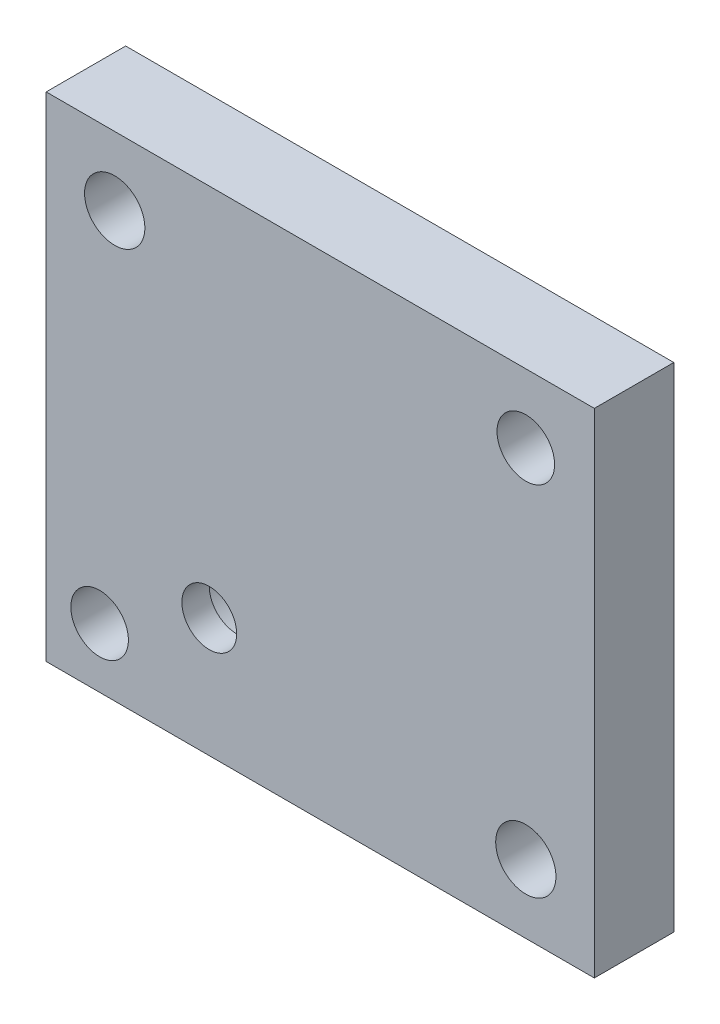
ISO-10303-21;
HEADER;
FILE_DESCRIPTION(('STEP AP214'),'2;1');
FILE_NAME('part.step','',(''),(''),'','','');
FILE_SCHEMA(('AUTOMOTIVE_DESIGN { 1 0 10303 214 1 1 1 1 }'));
ENDSEC;
DATA;
#1=APPLICATION_CONTEXT('core data for automotive mechanical design processes');
#2=APPLICATION_PROTOCOL_DEFINITION('international standard','automotive_design',2000,#1);
#3=PRODUCT_CONTEXT('',#1,'mechanical');
#4=PRODUCT('Part','Part','',(#3));
#5=PRODUCT_RELATED_PRODUCT_CATEGORY('part','',(#4));
#6=PRODUCT_DEFINITION_FORMATION('','',#4);
#7=PRODUCT_DEFINITION_CONTEXT('part definition',#1,'design');
#8=PRODUCT_DEFINITION('design','',#6,#7);
#9=PRODUCT_DEFINITION_SHAPE('','',#8);
#10=(LENGTH_UNIT() NAMED_UNIT(*) SI_UNIT(.MILLI.,.METRE.));
#11=(NAMED_UNIT(*) PLANE_ANGLE_UNIT() SI_UNIT($,.RADIAN.));
#12=(NAMED_UNIT(*) SI_UNIT($,.STERADIAN.) SOLID_ANGLE_UNIT());
#13=UNCERTAINTY_MEASURE_WITH_UNIT(LENGTH_MEASURE(1.E-05),#10,'distance_accuracy_value','');
#14=(GEOMETRIC_REPRESENTATION_CONTEXT(3) GLOBAL_UNCERTAINTY_ASSIGNED_CONTEXT((#13)) GLOBAL_UNIT_ASSIGNED_CONTEXT((#10,
#11,#12)) REPRESENTATION_CONTEXT('',''));
#15=CARTESIAN_POINT('',(0.,0.,0.));
#16=DIRECTION('',(0.,0.,1.));
#17=DIRECTION('',(1.,0.,0.));
#18=AXIS2_PLACEMENT_3D('',#15,#16,#17);
#19=CARTESIAN_POINT('',(0.,0.,0.));
#20=DIRECTION('',(0.,0.,-1.));
#21=DIRECTION('',(-1.,0.,0.));
#22=AXIS2_PLACEMENT_3D('',#19,#20,#21);
#23=PLANE('',#22);
#24=CARTESIAN_POINT('',(7.5,6.5,0.));
#25=DIRECTION('',(0.,0.,1.));
#26=DIRECTION('',(1.,0.,0.));
#27=AXIS2_PLACEMENT_3D('',#24,#25,#26);
#28=CIRCLE('',#27,1.05);
#29=CARTESIAN_POINT('',(6.45,6.5,0.));
#30=VERTEX_POINT('',#29);
#31=EDGE_CURVE('E108',#30,#30,#28,.T.);
#32=ORIENTED_EDGE('',*,*,#31,.T.);
#33=EDGE_LOOP('',(#32));
#34=FACE_BOUND('',#33,.T.);
#35=CARTESIAN_POINT('',(-7.5,6.5,0.));
#36=DIRECTION('',(0.,0.,1.));
#37=DIRECTION('',(1.,0.,0.));
#38=AXIS2_PLACEMENT_3D('',#35,#36,#37);
#39=CIRCLE('',#38,1.1);
#40=CARTESIAN_POINT('',(-8.6,6.5,0.));
#41=VERTEX_POINT('',#40);
#42=EDGE_CURVE('E114',#41,#41,#39,.T.);
#43=ORIENTED_EDGE('',*,*,#42,.T.);
#44=EDGE_LOOP('',(#43));
#45=FACE_BOUND('',#44,.T.);
#46=DIRECTION('',(0.,1.,0.));
#47=VECTOR('',#46,1.);
#48=CARTESIAN_POINT('',(10.,-9.,0.));
#49=LINE('',#48,#47);
#50=CARTESIAN_POINT('',(10.,-9.,0.));
#51=VERTEX_POINT('',#50);
#52=CARTESIAN_POINT('',(10.,9.,0.));
#53=VERTEX_POINT('',#52);
#54=EDGE_CURVE('E120',#51,#53,#49,.T.);
#55=ORIENTED_EDGE('',*,*,#54,.F.);
#56=DIRECTION('',(1.,0.,0.));
#57=VECTOR('',#56,1.);
#58=CARTESIAN_POINT('',(-10.,-9.,0.));
#59=LINE('',#58,#57);
#60=CARTESIAN_POINT('',(-10.,-9.,0.));
#61=VERTEX_POINT('',#60);
#62=EDGE_CURVE('E47',#61,#51,#59,.T.);
#63=ORIENTED_EDGE('',*,*,#62,.F.);
#64=DIRECTION('',(0.,-1.,0.));
#65=VECTOR('',#64,1.);
#66=CARTESIAN_POINT('',(-10.,-1.1,0.));
#67=LINE('',#66,#65);
#68=CARTESIAN_POINT('',(-10.,9.,0.));
#69=VERTEX_POINT('',#68);
#70=EDGE_CURVE('E55',#69,#61,#67,.T.);
#71=ORIENTED_EDGE('',*,*,#70,.F.);
#72=DIRECTION('',(-1.,0.,0.));
#73=VECTOR('',#72,1.);
#74=CARTESIAN_POINT('',(-10.,9.,0.));
#75=LINE('',#74,#73);
#76=EDGE_CURVE('E122',#53,#69,#75,.T.);
#77=ORIENTED_EDGE('',*,*,#76,.F.);
#78=EDGE_LOOP('',(#55,#63,#71,#77));
#79=FACE_BOUND('',#78,.T.);
#80=CARTESIAN_POINT('',(7.5,-6.5,0.));
#81=DIRECTION('',(0.,0.,1.));
#82=DIRECTION('',(1.,0.,0.));
#83=AXIS2_PLACEMENT_3D('',#80,#81,#82);
#84=CIRCLE('',#83,1.1);
#85=CARTESIAN_POINT('',(6.4,-6.5,0.));
#86=VERTEX_POINT('',#85);
#87=EDGE_CURVE('E117',#86,#86,#84,.T.);
#88=ORIENTED_EDGE('',*,*,#87,.T.);
#89=EDGE_LOOP('',(#88));
#90=FACE_BOUND('',#89,.T.);
#91=CARTESIAN_POINT('',(-8.05,-6.825,0.));
#92=DIRECTION('',(0.,0.,1.));
#93=DIRECTION('',(1.,0.,0.));
#94=AXIS2_PLACEMENT_3D('',#91,#92,#93);
#95=CIRCLE('',#94,1.05);
#96=CARTESIAN_POINT('',(-9.1,-6.825,0.));
#97=VERTEX_POINT('',#96);
#98=EDGE_CURVE('E111',#97,#97,#95,.T.);
#99=ORIENTED_EDGE('',*,*,#98,.T.);
#100=EDGE_LOOP('',(#99));
#101=FACE_BOUND('',#100,.T.);
#102=CARTESIAN_POINT('',(-4.05,-4.65,0.));
#103=DIRECTION('',(0.,0.,1.));
#104=DIRECTION('',(1.,0.,0.));
#105=AXIS2_PLACEMENT_3D('',#102,#103,#104);
#106=CIRCLE('',#105,2.);
#107=CARTESIAN_POINT('',(-6.05,-4.65,0.));
#108=VERTEX_POINT('',#107);
#109=EDGE_CURVE('E105',#108,#108,#106,.T.);
#110=ORIENTED_EDGE('',*,*,#109,.T.);
#111=EDGE_LOOP('',(#110));
#112=FACE_BOUND('',#111,.T.);
#113=ADVANCED_FACE('F32',(#34,#45,#79,#90,#101,#112),#23,.T.);
#114=CARTESIAN_POINT('',(10.,-9.,1.9));
#115=DIRECTION('',(-1.,0.,0.));
#116=DIRECTION('',(0.,0.,1.));
#117=AXIS2_PLACEMENT_3D('',#114,#115,#116);
#118=PLANE('',#117);
#119=ORIENTED_EDGE('',*,*,#54,.T.);
#120=DIRECTION('',(0.,0.,-1.));
#121=VECTOR('',#120,1.);
#122=CARTESIAN_POINT('',(10.,9.,1.9));
#123=LINE('',#122,#121);
#124=CARTESIAN_POINT('',(10.,9.,2.9));
#125=VERTEX_POINT('',#124);
#126=EDGE_CURVE('E11',#125,#53,#123,.T.);
#127=ORIENTED_EDGE('',*,*,#126,.F.);
#128=DIRECTION('',(0.,1.,0.));
#129=VECTOR('',#128,1.);
#130=CARTESIAN_POINT('',(10.,-9.,2.9));
#131=LINE('',#130,#129);
#132=CARTESIAN_POINT('',(10.,-9.,2.9));
#133=VERTEX_POINT('',#132);
#134=EDGE_CURVE('E82',#133,#125,#131,.T.);
#135=ORIENTED_EDGE('',*,*,#134,.F.);
#136=DIRECTION('',(0.,0.,-1.));
#137=VECTOR('',#136,1.);
#138=CARTESIAN_POINT('',(10.,-9.,1.9));
#139=LINE('',#138,#137);
#140=EDGE_CURVE('E71',#133,#51,#139,.T.);
#141=ORIENTED_EDGE('',*,*,#140,.T.);
#142=EDGE_LOOP('',(#119,#127,#135,#141));
#143=FACE_BOUND('',#142,.T.);
#144=ADVANCED_FACE('F34',(#143),#118,.F.);
#145=CARTESIAN_POINT('',(-10.,9.,1.9));
#146=DIRECTION('',(0.,-1.,0.));
#147=DIRECTION('',(0.,0.,-1.));
#148=AXIS2_PLACEMENT_3D('',#145,#146,#147);
#149=PLANE('',#148);
#150=ORIENTED_EDGE('',*,*,#76,.T.);
#151=DIRECTION('',(0.,0.,-1.));
#152=VECTOR('',#151,1.);
#153=CARTESIAN_POINT('',(-10.,9.,1.9));
#154=LINE('',#153,#152);
#155=CARTESIAN_POINT('',(-10.,9.,2.9));
#156=VERTEX_POINT('',#155);
#157=EDGE_CURVE('E40',#156,#69,#154,.T.);
#158=ORIENTED_EDGE('',*,*,#157,.F.);
#159=DIRECTION('',(-1.,0.,0.));
#160=VECTOR('',#159,1.);
#161=CARTESIAN_POINT('',(10.,9.,2.9));
#162=LINE('',#161,#160);
#163=EDGE_CURVE('E86',#125,#156,#162,.T.);
#164=ORIENTED_EDGE('',*,*,#163,.F.);
#165=ORIENTED_EDGE('',*,*,#126,.T.);
#166=EDGE_LOOP('',(#150,#158,#164,#165));
#167=FACE_BOUND('',#166,.T.);
#168=ADVANCED_FACE('F129',(#167),#149,.F.);
#169=CARTESIAN_POINT('',(-10.,-1.1,1.9));
#170=DIRECTION('',(1.,0.,0.));
#171=DIRECTION('',(0.,0.,-1.));
#172=AXIS2_PLACEMENT_3D('',#169,#170,#171);
#173=PLANE('',#172);
#174=ORIENTED_EDGE('',*,*,#70,.T.);
#175=DIRECTION('',(0.,0.,-1.));
#176=VECTOR('',#175,1.);
#177=CARTESIAN_POINT('',(-10.,-9.,1.9));
#178=LINE('',#177,#176);
#179=CARTESIAN_POINT('',(-10.,-9.,2.9));
#180=VERTEX_POINT('',#179);
#181=EDGE_CURVE('E79',#180,#61,#178,.T.);
#182=ORIENTED_EDGE('',*,*,#181,.F.);
#183=DIRECTION('',(0.,-1.,0.));
#184=VECTOR('',#183,1.);
#185=CARTESIAN_POINT('',(-10.,9.,2.9));
#186=LINE('',#185,#184);
#187=EDGE_CURVE('E92',#156,#180,#186,.T.);
#188=ORIENTED_EDGE('',*,*,#187,.F.);
#189=ORIENTED_EDGE('',*,*,#157,.T.);
#190=EDGE_LOOP('',(#174,#182,#188,#189));
#191=FACE_BOUND('',#190,.T.);
#192=ADVANCED_FACE('F127',(#191),#173,.F.);
#193=CARTESIAN_POINT('',(-10.,-9.,1.9));
#194=DIRECTION('',(0.,1.,0.));
#195=DIRECTION('',(0.,0.,1.));
#196=AXIS2_PLACEMENT_3D('',#193,#194,#195);
#197=PLANE('',#196);
#198=ORIENTED_EDGE('',*,*,#62,.T.);
#199=ORIENTED_EDGE('',*,*,#140,.F.);
#200=DIRECTION('',(1.,0.,0.));
#201=VECTOR('',#200,1.);
#202=CARTESIAN_POINT('',(-10.,-9.,2.9));
#203=LINE('',#202,#201);
#204=EDGE_CURVE('E75',#180,#133,#203,.T.);
#205=ORIENTED_EDGE('',*,*,#204,.F.);
#206=ORIENTED_EDGE('',*,*,#181,.T.);
#207=EDGE_LOOP('',(#198,#199,#205,#206));
#208=FACE_BOUND('',#207,.T.);
#209=ADVANCED_FACE('F73',(#208),#197,.F.);
#210=CARTESIAN_POINT('',(7.5,-6.5,1.9));
#211=DIRECTION('',(0.,0.,-1.));
#212=DIRECTION('',(-1.,0.,0.));
#213=AXIS2_PLACEMENT_3D('',#210,#211,#212);
#214=CYLINDRICAL_SURFACE('',#213,1.1);
#215=CARTESIAN_POINT('',(7.5,-6.5,2.9));
#216=DIRECTION('',(0.,0.,1.));
#217=DIRECTION('',(1.,0.,0.));
#218=AXIS2_PLACEMENT_3D('',#215,#216,#217);
#219=CIRCLE('',#218,1.1);
#220=CARTESIAN_POINT('',(6.4,-6.5,2.9));
#221=VERTEX_POINT('',#220);
#222=EDGE_CURVE('E289',#221,#221,#219,.T.);
#223=CARTESIAN_POINT('',(6.4,-6.5,0.));
#224=CARTESIAN_POINT('',(6.4,-6.5,0.0302083333333333));
#225=CARTESIAN_POINT('',(6.4,-6.5,0.0604166666666667));
#226=CARTESIAN_POINT('',(6.4,-6.5,0.120833333333333));
#227=CARTESIAN_POINT('',(6.4,-6.5,0.151041666666667));
#228=CARTESIAN_POINT('',(6.4,-6.5,0.211458333333333));
#229=CARTESIAN_POINT('',(6.4,-6.5,0.241666666666667));
#230=CARTESIAN_POINT('',(6.4,-6.5,0.302083333333333));
#231=CARTESIAN_POINT('',(6.4,-6.5,0.332291666666667));
#232=CARTESIAN_POINT('',(6.4,-6.5,0.392708333333333));
#233=CARTESIAN_POINT('',(6.4,-6.5,0.422916666666667));
#234=CARTESIAN_POINT('',(6.4,-6.5,0.483333333333333));
#235=CARTESIAN_POINT('',(6.4,-6.5,0.513541666666667));
#236=CARTESIAN_POINT('',(6.4,-6.5,0.573958333333333));
#237=CARTESIAN_POINT('',(6.4,-6.5,0.604166666666667));
#238=CARTESIAN_POINT('',(6.4,-6.5,0.664583333333333));
#239=CARTESIAN_POINT('',(6.4,-6.5,0.694791666666667));
#240=CARTESIAN_POINT('',(6.4,-6.5,0.755208333333333));
#241=CARTESIAN_POINT('',(6.4,-6.5,0.785416666666667));
#242=CARTESIAN_POINT('',(6.4,-6.5,0.845833333333333));
#243=CARTESIAN_POINT('',(6.4,-6.5,0.876041666666667));
#244=CARTESIAN_POINT('',(6.4,-6.5,0.936458333333333));
#245=CARTESIAN_POINT('',(6.4,-6.5,0.966666666666667));
#246=CARTESIAN_POINT('',(6.4,-6.5,1.02708333333333));
#247=CARTESIAN_POINT('',(6.4,-6.5,1.05729166666667));
#248=CARTESIAN_POINT('',(6.4,-6.5,1.11770833333333));
#249=CARTESIAN_POINT('',(6.4,-6.5,1.14791666666667));
#250=CARTESIAN_POINT('',(6.4,-6.5,1.20833333333333));
#251=CARTESIAN_POINT('',(6.4,-6.5,1.23854166666667));
#252=CARTESIAN_POINT('',(6.4,-6.5,1.29895833333333));
#253=CARTESIAN_POINT('',(6.4,-6.5,1.32916666666667));
#254=CARTESIAN_POINT('',(6.4,-6.5,1.38958333333333));
#255=CARTESIAN_POINT('',(6.4,-6.5,1.41979166666667));
#256=CARTESIAN_POINT('',(6.4,-6.5,1.48020833333333));
#257=CARTESIAN_POINT('',(6.4,-6.5,1.51041666666667));
#258=CARTESIAN_POINT('',(6.4,-6.5,1.57083333333333));
#259=CARTESIAN_POINT('',(6.4,-6.5,1.60104166666667));
#260=CARTESIAN_POINT('',(6.4,-6.5,1.66145833333333));
#261=CARTESIAN_POINT('',(6.4,-6.5,1.69166666666667));
#262=CARTESIAN_POINT('',(6.4,-6.5,1.75208333333333));
#263=CARTESIAN_POINT('',(6.4,-6.5,1.78229166666667));
#264=CARTESIAN_POINT('',(6.4,-6.5,1.84270833333333));
#265=CARTESIAN_POINT('',(6.4,-6.5,1.87291666666667));
#266=CARTESIAN_POINT('',(6.4,-6.5,1.93333333333333));
#267=CARTESIAN_POINT('',(6.4,-6.5,1.96354166666667));
#268=CARTESIAN_POINT('',(6.4,-6.5,2.02395833333333));
#269=CARTESIAN_POINT('',(6.4,-6.5,2.05416666666667));
#270=CARTESIAN_POINT('',(6.4,-6.5,2.11458333333333));
#271=CARTESIAN_POINT('',(6.4,-6.5,2.14479166666667));
#272=CARTESIAN_POINT('',(6.4,-6.5,2.20520833333333));
#273=CARTESIAN_POINT('',(6.4,-6.5,2.23541666666667));
#274=CARTESIAN_POINT('',(6.4,-6.5,2.29583333333333));
#275=CARTESIAN_POINT('',(6.4,-6.5,2.32604166666667));
#276=CARTESIAN_POINT('',(6.4,-6.5,2.38645833333333));
#277=CARTESIAN_POINT('',(6.4,-6.5,2.41666666666667));
#278=CARTESIAN_POINT('',(6.4,-6.5,2.47708333333333));
#279=CARTESIAN_POINT('',(6.4,-6.5,2.50729166666667));
#280=CARTESIAN_POINT('',(6.4,-6.5,2.56770833333333));
#281=CARTESIAN_POINT('',(6.4,-6.5,2.59791666666667));
#282=CARTESIAN_POINT('',(6.4,-6.5,2.65833333333333));
#283=CARTESIAN_POINT('',(6.4,-6.5,2.68854166666667));
#284=CARTESIAN_POINT('',(6.4,-6.5,2.74895833333333));
#285=CARTESIAN_POINT('',(6.4,-6.5,2.77916666666667));
#286=CARTESIAN_POINT('',(6.4,-6.5,2.83958333333333));
#287=CARTESIAN_POINT('',(6.4,-6.5,2.86979166666667));
#288=CARTESIAN_POINT('',(6.4,-6.5,2.9));
#289=B_SPLINE_CURVE_WITH_KNOTS('',3,(#223,#224,#225,#226,#227,#228,#229,#230,#231,#232,#233,
#234,#235,#236,#237,#238,#239,#240,#241,#242,#243,#244,#245,#246,#247,#248,#249,#250,#251,#252,
#253,#254,#255,#256,#257,#258,#259,#260,#261,#262,#263,#264,#265,#266,#267,#268,#269,#270,#271,
#272,#273,#274,#275,#276,#277,#278,#279,#280,#281,#282,#283,#284,#285,#286,#287,#288),
.UNSPECIFIED.,.F.,.F.,(4,2,2,2,2,2,2,2,2,2,2,2,2,2,2,2,2,2,2,2,2,2,2,2,2,2,2,2,2,2,2,2,4),(0.,
0.090625,0.18125,0.271875,0.3625,0.453125,0.54375,0.634375,0.725,0.815625,0.90625,0.996875,
1.0875,1.178125,1.26875,1.359375,1.45,1.540625,1.63125,1.721875,1.8125,1.903125,1.99375,
2.084375,2.175,2.265625,2.35625,2.446875,2.5375,2.628125,2.71875,2.809375,2.9),.UNSPECIFIED.);
#290=EDGE_CURVE('BSEAM164',#86,#221,#289,.T.);
#291=ORIENTED_EDGE('',*,*,#87,.F.);
#292=ORIENTED_EDGE('',*,*,#222,.T.);
#293=ORIENTED_EDGE('',*,*,#290,.T.);
#294=ORIENTED_EDGE('',*,*,#290,.F.);
#295=EDGE_LOOP('',(#291,#293,#292,#294));
#296=FACE_BOUND('',#295,.T.);
#297=ADVANCED_FACE('F164',(#296),#214,.F.);
#298=CARTESIAN_POINT('',(-7.5,6.5,1.9));
#299=DIRECTION('',(0.,0.,-1.));
#300=DIRECTION('',(-1.,0.,0.));
#301=AXIS2_PLACEMENT_3D('',#298,#299,#300);
#302=CYLINDRICAL_SURFACE('',#301,1.1);
#303=CARTESIAN_POINT('',(-7.5,6.5,2.9));
#304=DIRECTION('',(0.,0.,1.));
#305=DIRECTION('',(1.,0.,0.));
#306=AXIS2_PLACEMENT_3D('',#303,#304,#305);
#307=CIRCLE('',#306,1.1);
#308=CARTESIAN_POINT('',(-8.6,6.5,2.9));
#309=VERTEX_POINT('',#308);
#310=EDGE_CURVE('E93',#309,#309,#307,.T.);
#311=CARTESIAN_POINT('',(-8.6,6.5,0.));
#312=CARTESIAN_POINT('',(-8.6,6.5,0.0302083333333333));
#313=CARTESIAN_POINT('',(-8.6,6.5,0.0604166666666667));
#314=CARTESIAN_POINT('',(-8.6,6.5,0.120833333333333));
#315=CARTESIAN_POINT('',(-8.6,6.5,0.151041666666667));
#316=CARTESIAN_POINT('',(-8.6,6.5,0.211458333333333));
#317=CARTESIAN_POINT('',(-8.6,6.5,0.241666666666667));
#318=CARTESIAN_POINT('',(-8.6,6.5,0.302083333333333));
#319=CARTESIAN_POINT('',(-8.6,6.5,0.332291666666667));
#320=CARTESIAN_POINT('',(-8.6,6.5,0.392708333333333));
#321=CARTESIAN_POINT('',(-8.6,6.5,0.422916666666667));
#322=CARTESIAN_POINT('',(-8.6,6.5,0.483333333333333));
#323=CARTESIAN_POINT('',(-8.6,6.5,0.513541666666667));
#324=CARTESIAN_POINT('',(-8.6,6.5,0.573958333333333));
#325=CARTESIAN_POINT('',(-8.6,6.5,0.604166666666667));
#326=CARTESIAN_POINT('',(-8.6,6.5,0.664583333333333));
#327=CARTESIAN_POINT('',(-8.6,6.5,0.694791666666667));
#328=CARTESIAN_POINT('',(-8.6,6.5,0.755208333333333));
#329=CARTESIAN_POINT('',(-8.6,6.5,0.785416666666667));
#330=CARTESIAN_POINT('',(-8.6,6.5,0.845833333333333));
#331=CARTESIAN_POINT('',(-8.6,6.5,0.876041666666667));
#332=CARTESIAN_POINT('',(-8.6,6.5,0.936458333333333));
#333=CARTESIAN_POINT('',(-8.6,6.5,0.966666666666667));
#334=CARTESIAN_POINT('',(-8.6,6.5,1.02708333333333));
#335=CARTESIAN_POINT('',(-8.6,6.5,1.05729166666667));
#336=CARTESIAN_POINT('',(-8.6,6.5,1.11770833333333));
#337=CARTESIAN_POINT('',(-8.6,6.5,1.14791666666667));
#338=CARTESIAN_POINT('',(-8.6,6.5,1.20833333333333));
#339=CARTESIAN_POINT('',(-8.6,6.5,1.23854166666667));
#340=CARTESIAN_POINT('',(-8.6,6.5,1.29895833333333));
#341=CARTESIAN_POINT('',(-8.6,6.5,1.32916666666667));
#342=CARTESIAN_POINT('',(-8.6,6.5,1.38958333333333));
#343=CARTESIAN_POINT('',(-8.6,6.5,1.41979166666667));
#344=CARTESIAN_POINT('',(-8.6,6.5,1.48020833333333));
#345=CARTESIAN_POINT('',(-8.6,6.5,1.51041666666667));
#346=CARTESIAN_POINT('',(-8.6,6.5,1.57083333333333));
#347=CARTESIAN_POINT('',(-8.6,6.5,1.60104166666667));
#348=CARTESIAN_POINT('',(-8.6,6.5,1.66145833333333));
#349=CARTESIAN_POINT('',(-8.6,6.5,1.69166666666667));
#350=CARTESIAN_POINT('',(-8.6,6.5,1.75208333333333));
#351=CARTESIAN_POINT('',(-8.6,6.5,1.78229166666667));
#352=CARTESIAN_POINT('',(-8.6,6.5,1.84270833333333));
#353=CARTESIAN_POINT('',(-8.6,6.5,1.87291666666667));
#354=CARTESIAN_POINT('',(-8.6,6.5,1.93333333333333));
#355=CARTESIAN_POINT('',(-8.6,6.5,1.96354166666667));
#356=CARTESIAN_POINT('',(-8.6,6.5,2.02395833333333));
#357=CARTESIAN_POINT('',(-8.6,6.5,2.05416666666667));
#358=CARTESIAN_POINT('',(-8.6,6.5,2.11458333333333));
#359=CARTESIAN_POINT('',(-8.6,6.5,2.14479166666667));
#360=CARTESIAN_POINT('',(-8.6,6.5,2.20520833333333));
#361=CARTESIAN_POINT('',(-8.6,6.5,2.23541666666667));
#362=CARTESIAN_POINT('',(-8.6,6.5,2.29583333333333));
#363=CARTESIAN_POINT('',(-8.6,6.5,2.32604166666667));
#364=CARTESIAN_POINT('',(-8.6,6.5,2.38645833333333));
#365=CARTESIAN_POINT('',(-8.6,6.5,2.41666666666667));
#366=CARTESIAN_POINT('',(-8.6,6.5,2.47708333333333));
#367=CARTESIAN_POINT('',(-8.6,6.5,2.50729166666667));
#368=CARTESIAN_POINT('',(-8.6,6.5,2.56770833333333));
#369=CARTESIAN_POINT('',(-8.6,6.5,2.59791666666667));
#370=CARTESIAN_POINT('',(-8.6,6.5,2.65833333333333));
#371=CARTESIAN_POINT('',(-8.6,6.5,2.68854166666667));
#372=CARTESIAN_POINT('',(-8.6,6.5,2.74895833333333));
#373=CARTESIAN_POINT('',(-8.6,6.5,2.77916666666667));
#374=CARTESIAN_POINT('',(-8.6,6.5,2.83958333333333));
#375=CARTESIAN_POINT('',(-8.6,6.5,2.86979166666667));
#376=CARTESIAN_POINT('',(-8.6,6.5,2.9));
#377=B_SPLINE_CURVE_WITH_KNOTS('',3,(#311,#312,#313,#314,#315,#316,#317,#318,#319,#320,#321,
#322,#323,#324,#325,#326,#327,#328,#329,#330,#331,#332,#333,#334,#335,#336,#337,#338,#339,#340,
#341,#342,#343,#344,#345,#346,#347,#348,#349,#350,#351,#352,#353,#354,#355,#356,#357,#358,#359,
#360,#361,#362,#363,#364,#365,#366,#367,#368,#369,#370,#371,#372,#373,#374,#375,#376),
.UNSPECIFIED.,.F.,.F.,(4,2,2,2,2,2,2,2,2,2,2,2,2,2,2,2,2,2,2,2,2,2,2,2,2,2,2,2,2,2,2,2,4),(0.,
0.090625,0.18125,0.271875,0.3625,0.453125,0.54375,0.634375,0.725,0.815625,0.90625,0.996875,
1.0875,1.178125,1.26875,1.359375,1.45,1.540625,1.63125,1.721875,1.8125,1.903125,1.99375,
2.084375,2.175,2.265625,2.35625,2.446875,2.5375,2.628125,2.71875,2.809375,2.9),.UNSPECIFIED.);
#378=EDGE_CURVE('BSEAM160',#41,#309,#377,.T.);
#379=ORIENTED_EDGE('',*,*,#42,.F.);
#380=ORIENTED_EDGE('',*,*,#310,.T.);
#381=ORIENTED_EDGE('',*,*,#378,.T.);
#382=ORIENTED_EDGE('',*,*,#378,.F.);
#383=EDGE_LOOP('',(#379,#381,#380,#382));
#384=FACE_BOUND('',#383,.T.);
#385=ADVANCED_FACE('F160',(#384),#302,.F.);
#386=CARTESIAN_POINT('',(-8.05,-6.825,1.9));
#387=DIRECTION('',(0.,0.,-1.));
#388=DIRECTION('',(-1.,0.,0.));
#389=AXIS2_PLACEMENT_3D('',#386,#387,#388);
#390=CYLINDRICAL_SURFACE('',#389,1.05);
#391=CARTESIAN_POINT('',(-8.05,-6.825,2.9));
#392=DIRECTION('',(0.,0.,1.));
#393=DIRECTION('',(1.,0.,0.));
#394=AXIS2_PLACEMENT_3D('',#391,#392,#393);
#395=CIRCLE('',#394,1.05);
#396=CARTESIAN_POINT('',(-9.1,-6.825,2.9));
#397=VERTEX_POINT('',#396);
#398=EDGE_CURVE('E284',#397,#397,#395,.T.);
#399=CARTESIAN_POINT('',(-9.1,-6.825,0.));
#400=CARTESIAN_POINT('',(-9.1,-6.825,0.0302083333333333));
#401=CARTESIAN_POINT('',(-9.1,-6.825,0.0604166666666667));
#402=CARTESIAN_POINT('',(-9.1,-6.825,0.120833333333333));
#403=CARTESIAN_POINT('',(-9.1,-6.825,0.151041666666667));
#404=CARTESIAN_POINT('',(-9.1,-6.825,0.211458333333333));
#405=CARTESIAN_POINT('',(-9.1,-6.825,0.241666666666667));
#406=CARTESIAN_POINT('',(-9.1,-6.825,0.302083333333333));
#407=CARTESIAN_POINT('',(-9.1,-6.825,0.332291666666667));
#408=CARTESIAN_POINT('',(-9.1,-6.825,0.392708333333333));
#409=CARTESIAN_POINT('',(-9.1,-6.825,0.422916666666667));
#410=CARTESIAN_POINT('',(-9.1,-6.825,0.483333333333333));
#411=CARTESIAN_POINT('',(-9.1,-6.825,0.513541666666667));
#412=CARTESIAN_POINT('',(-9.1,-6.825,0.573958333333333));
#413=CARTESIAN_POINT('',(-9.1,-6.825,0.604166666666667));
#414=CARTESIAN_POINT('',(-9.1,-6.825,0.664583333333333));
#415=CARTESIAN_POINT('',(-9.1,-6.825,0.694791666666667));
#416=CARTESIAN_POINT('',(-9.1,-6.825,0.755208333333333));
#417=CARTESIAN_POINT('',(-9.1,-6.825,0.785416666666667));
#418=CARTESIAN_POINT('',(-9.1,-6.825,0.845833333333333));
#419=CARTESIAN_POINT('',(-9.1,-6.825,0.876041666666667));
#420=CARTESIAN_POINT('',(-9.1,-6.825,0.936458333333333));
#421=CARTESIAN_POINT('',(-9.1,-6.825,0.966666666666667));
#422=CARTESIAN_POINT('',(-9.1,-6.825,1.02708333333333));
#423=CARTESIAN_POINT('',(-9.1,-6.825,1.05729166666667));
#424=CARTESIAN_POINT('',(-9.1,-6.825,1.11770833333333));
#425=CARTESIAN_POINT('',(-9.1,-6.825,1.14791666666667));
#426=CARTESIAN_POINT('',(-9.1,-6.825,1.20833333333333));
#427=CARTESIAN_POINT('',(-9.1,-6.825,1.23854166666667));
#428=CARTESIAN_POINT('',(-9.1,-6.825,1.29895833333333));
#429=CARTESIAN_POINT('',(-9.1,-6.825,1.32916666666667));
#430=CARTESIAN_POINT('',(-9.1,-6.825,1.38958333333333));
#431=CARTESIAN_POINT('',(-9.1,-6.825,1.41979166666667));
#432=CARTESIAN_POINT('',(-9.1,-6.825,1.48020833333333));
#433=CARTESIAN_POINT('',(-9.1,-6.825,1.51041666666667));
#434=CARTESIAN_POINT('',(-9.1,-6.825,1.57083333333333));
#435=CARTESIAN_POINT('',(-9.1,-6.825,1.60104166666667));
#436=CARTESIAN_POINT('',(-9.1,-6.825,1.66145833333333));
#437=CARTESIAN_POINT('',(-9.1,-6.825,1.69166666666667));
#438=CARTESIAN_POINT('',(-9.1,-6.825,1.75208333333333));
#439=CARTESIAN_POINT('',(-9.1,-6.825,1.78229166666667));
#440=CARTESIAN_POINT('',(-9.1,-6.825,1.84270833333333));
#441=CARTESIAN_POINT('',(-9.1,-6.825,1.87291666666667));
#442=CARTESIAN_POINT('',(-9.1,-6.825,1.93333333333333));
#443=CARTESIAN_POINT('',(-9.1,-6.825,1.96354166666667));
#444=CARTESIAN_POINT('',(-9.1,-6.825,2.02395833333333));
#445=CARTESIAN_POINT('',(-9.1,-6.825,2.05416666666667));
#446=CARTESIAN_POINT('',(-9.1,-6.825,2.11458333333333));
#447=CARTESIAN_POINT('',(-9.1,-6.825,2.14479166666667));
#448=CARTESIAN_POINT('',(-9.1,-6.825,2.20520833333333));
#449=CARTESIAN_POINT('',(-9.1,-6.825,2.23541666666667));
#450=CARTESIAN_POINT('',(-9.1,-6.825,2.29583333333333));
#451=CARTESIAN_POINT('',(-9.1,-6.825,2.32604166666667));
#452=CARTESIAN_POINT('',(-9.1,-6.825,2.38645833333333));
#453=CARTESIAN_POINT('',(-9.1,-6.825,2.41666666666667));
#454=CARTESIAN_POINT('',(-9.1,-6.825,2.47708333333333));
#455=CARTESIAN_POINT('',(-9.1,-6.825,2.50729166666667));
#456=CARTESIAN_POINT('',(-9.1,-6.825,2.56770833333333));
#457=CARTESIAN_POINT('',(-9.1,-6.825,2.59791666666667));
#458=CARTESIAN_POINT('',(-9.1,-6.825,2.65833333333333));
#459=CARTESIAN_POINT('',(-9.1,-6.825,2.68854166666667));
#460=CARTESIAN_POINT('',(-9.1,-6.825,2.74895833333333));
#461=CARTESIAN_POINT('',(-9.1,-6.825,2.77916666666667));
#462=CARTESIAN_POINT('',(-9.1,-6.825,2.83958333333333));
#463=CARTESIAN_POINT('',(-9.1,-6.825,2.86979166666667));
#464=CARTESIAN_POINT('',(-9.1,-6.825,2.9));
#465=B_SPLINE_CURVE_WITH_KNOTS('',3,(#399,#400,#401,#402,#403,#404,#405,#406,#407,#408,#409,
#410,#411,#412,#413,#414,#415,#416,#417,#418,#419,#420,#421,#422,#423,#424,#425,#426,#427,#428,
#429,#430,#431,#432,#433,#434,#435,#436,#437,#438,#439,#440,#441,#442,#443,#444,#445,#446,#447,
#448,#449,#450,#451,#452,#453,#454,#455,#456,#457,#458,#459,#460,#461,#462,#463,#464),
.UNSPECIFIED.,.F.,.F.,(4,2,2,2,2,2,2,2,2,2,2,2,2,2,2,2,2,2,2,2,2,2,2,2,2,2,2,2,2,2,2,2,4),(0.,
0.090625,0.18125,0.271875,0.3625,0.453125,0.54375,0.634375,0.725,0.815625,0.90625,0.996875,
1.0875,1.178125,1.26875,1.359375,1.45,1.540625,1.63125,1.721875,1.8125,1.903125,1.99375,
2.084375,2.175,2.265625,2.35625,2.446875,2.5375,2.628125,2.71875,2.809375,2.9),.UNSPECIFIED.);
#466=EDGE_CURVE('BSEAM153',#97,#397,#465,.T.);
#467=ORIENTED_EDGE('',*,*,#98,.F.);
#468=ORIENTED_EDGE('',*,*,#398,.T.);
#469=ORIENTED_EDGE('',*,*,#466,.T.);
#470=ORIENTED_EDGE('',*,*,#466,.F.);
#471=EDGE_LOOP('',(#467,#469,#468,#470));
#472=FACE_BOUND('',#471,.T.);
#473=ADVANCED_FACE('F153',(#472),#390,.F.);
#474=CARTESIAN_POINT('',(7.5,6.5,1.9));
#475=DIRECTION('',(0.,0.,-1.));
#476=DIRECTION('',(-1.,0.,0.));
#477=AXIS2_PLACEMENT_3D('',#474,#475,#476);
#478=CYLINDRICAL_SURFACE('',#477,1.05);
#479=CARTESIAN_POINT('',(7.5,6.5,2.9));
#480=DIRECTION('',(0.,0.,1.));
#481=DIRECTION('',(1.,0.,0.));
#482=AXIS2_PLACEMENT_3D('',#479,#480,#481);
#483=CIRCLE('',#482,1.05);
#484=CARTESIAN_POINT('',(6.45,6.5,2.9));
#485=VERTEX_POINT('',#484);
#486=EDGE_CURVE('E96',#485,#485,#483,.T.);
#487=CARTESIAN_POINT('',(6.45,6.5,0.));
#488=CARTESIAN_POINT('',(6.45,6.5,0.0302083333333333));
#489=CARTESIAN_POINT('',(6.45,6.5,0.0604166666666667));
#490=CARTESIAN_POINT('',(6.45,6.5,0.120833333333333));
#491=CARTESIAN_POINT('',(6.45,6.5,0.151041666666667));
#492=CARTESIAN_POINT('',(6.45,6.5,0.211458333333333));
#493=CARTESIAN_POINT('',(6.45,6.5,0.241666666666667));
#494=CARTESIAN_POINT('',(6.45,6.5,0.302083333333333));
#495=CARTESIAN_POINT('',(6.45,6.5,0.332291666666667));
#496=CARTESIAN_POINT('',(6.45,6.5,0.392708333333333));
#497=CARTESIAN_POINT('',(6.45,6.5,0.422916666666667));
#498=CARTESIAN_POINT('',(6.45,6.5,0.483333333333333));
#499=CARTESIAN_POINT('',(6.45,6.5,0.513541666666667));
#500=CARTESIAN_POINT('',(6.45,6.5,0.573958333333333));
#501=CARTESIAN_POINT('',(6.45,6.5,0.604166666666667));
#502=CARTESIAN_POINT('',(6.45,6.5,0.664583333333333));
#503=CARTESIAN_POINT('',(6.45,6.5,0.694791666666667));
#504=CARTESIAN_POINT('',(6.45,6.5,0.755208333333333));
#505=CARTESIAN_POINT('',(6.45,6.5,0.785416666666667));
#506=CARTESIAN_POINT('',(6.45,6.5,0.845833333333333));
#507=CARTESIAN_POINT('',(6.45,6.5,0.876041666666667));
#508=CARTESIAN_POINT('',(6.45,6.5,0.936458333333333));
#509=CARTESIAN_POINT('',(6.45,6.5,0.966666666666667));
#510=CARTESIAN_POINT('',(6.45,6.5,1.02708333333333));
#511=CARTESIAN_POINT('',(6.45,6.5,1.05729166666667));
#512=CARTESIAN_POINT('',(6.45,6.5,1.11770833333333));
#513=CARTESIAN_POINT('',(6.45,6.5,1.14791666666667));
#514=CARTESIAN_POINT('',(6.45,6.5,1.20833333333333));
#515=CARTESIAN_POINT('',(6.45,6.5,1.23854166666667));
#516=CARTESIAN_POINT('',(6.45,6.5,1.29895833333333));
#517=CARTESIAN_POINT('',(6.45,6.5,1.32916666666667));
#518=CARTESIAN_POINT('',(6.45,6.5,1.38958333333333));
#519=CARTESIAN_POINT('',(6.45,6.5,1.41979166666667));
#520=CARTESIAN_POINT('',(6.45,6.5,1.48020833333333));
#521=CARTESIAN_POINT('',(6.45,6.5,1.51041666666667));
#522=CARTESIAN_POINT('',(6.45,6.5,1.57083333333333));
#523=CARTESIAN_POINT('',(6.45,6.5,1.60104166666667));
#524=CARTESIAN_POINT('',(6.45,6.5,1.66145833333333));
#525=CARTESIAN_POINT('',(6.45,6.5,1.69166666666667));
#526=CARTESIAN_POINT('',(6.45,6.5,1.75208333333333));
#527=CARTESIAN_POINT('',(6.45,6.5,1.78229166666667));
#528=CARTESIAN_POINT('',(6.45,6.5,1.84270833333333));
#529=CARTESIAN_POINT('',(6.45,6.5,1.87291666666667));
#530=CARTESIAN_POINT('',(6.45,6.5,1.93333333333333));
#531=CARTESIAN_POINT('',(6.45,6.5,1.96354166666667));
#532=CARTESIAN_POINT('',(6.45,6.5,2.02395833333333));
#533=CARTESIAN_POINT('',(6.45,6.5,2.05416666666667));
#534=CARTESIAN_POINT('',(6.45,6.5,2.11458333333333));
#535=CARTESIAN_POINT('',(6.45,6.5,2.14479166666667));
#536=CARTESIAN_POINT('',(6.45,6.5,2.20520833333333));
#537=CARTESIAN_POINT('',(6.45,6.5,2.23541666666667));
#538=CARTESIAN_POINT('',(6.45,6.5,2.29583333333333));
#539=CARTESIAN_POINT('',(6.45,6.5,2.32604166666667));
#540=CARTESIAN_POINT('',(6.45,6.5,2.38645833333333));
#541=CARTESIAN_POINT('',(6.45,6.5,2.41666666666667));
#542=CARTESIAN_POINT('',(6.45,6.5,2.47708333333333));
#543=CARTESIAN_POINT('',(6.45,6.5,2.50729166666667));
#544=CARTESIAN_POINT('',(6.45,6.5,2.56770833333333));
#545=CARTESIAN_POINT('',(6.45,6.5,2.59791666666667));
#546=CARTESIAN_POINT('',(6.45,6.5,2.65833333333333));
#547=CARTESIAN_POINT('',(6.45,6.5,2.68854166666667));
#548=CARTESIAN_POINT('',(6.45,6.5,2.74895833333333));
#549=CARTESIAN_POINT('',(6.45,6.5,2.77916666666667));
#550=CARTESIAN_POINT('',(6.45,6.5,2.83958333333333));
#551=CARTESIAN_POINT('',(6.45,6.5,2.86979166666667));
#552=CARTESIAN_POINT('',(6.45,6.5,2.9));
#553=B_SPLINE_CURVE_WITH_KNOTS('',3,(#487,#488,#489,#490,#491,#492,#493,#494,#495,#496,#497,
#498,#499,#500,#501,#502,#503,#504,#505,#506,#507,#508,#509,#510,#511,#512,#513,#514,#515,#516,
#517,#518,#519,#520,#521,#522,#523,#524,#525,#526,#527,#528,#529,#530,#531,#532,#533,#534,#535,
#536,#537,#538,#539,#540,#541,#542,#543,#544,#545,#546,#547,#548,#549,#550,#551,#552),
.UNSPECIFIED.,.F.,.F.,(4,2,2,2,2,2,2,2,2,2,2,2,2,2,2,2,2,2,2,2,2,2,2,2,2,2,2,2,2,2,2,2,4),(0.,
0.090625,0.18125,0.271875,0.3625,0.453125,0.54375,0.634375,0.725,0.815625,0.90625,0.996875,
1.0875,1.178125,1.26875,1.359375,1.45,1.540625,1.63125,1.721875,1.8125,1.903125,1.99375,
2.084375,2.175,2.265625,2.35625,2.446875,2.5375,2.628125,2.71875,2.809375,2.9),.UNSPECIFIED.);
#554=EDGE_CURVE('BSEAM144',#30,#485,#553,.T.);
#555=ORIENTED_EDGE('',*,*,#31,.F.);
#556=ORIENTED_EDGE('',*,*,#486,.T.);
#557=ORIENTED_EDGE('',*,*,#554,.T.);
#558=ORIENTED_EDGE('',*,*,#554,.F.);
#559=EDGE_LOOP('',(#555,#557,#556,#558));
#560=FACE_BOUND('',#559,.T.);
#561=ADVANCED_FACE('F144',(#560),#478,.F.);
#562=CARTESIAN_POINT('',(-4.05,-4.65,1.9));
#563=DIRECTION('',(0.,0.,-1.));
#564=DIRECTION('',(-1.,0.,0.));
#565=AXIS2_PLACEMENT_3D('',#562,#563,#564);
#566=CYLINDRICAL_SURFACE('',#565,2.);
#567=CARTESIAN_POINT('',(-4.05,-4.65,1.9));
#568=DIRECTION('',(0.,0.,1.));
#569=DIRECTION('',(1.,0.,0.));
#570=AXIS2_PLACEMENT_3D('',#567,#568,#569);
#571=CIRCLE('',#570,2.);
#572=CARTESIAN_POINT('',(-6.05,-4.65,1.9));
#573=VERTEX_POINT('',#572);
#574=EDGE_CURVE('E102',#573,#573,#571,.T.);
#575=CARTESIAN_POINT('',(-6.05,-4.65,1.9));
#576=CARTESIAN_POINT('',(-6.05,-4.65,1.88020833333333));
#577=CARTESIAN_POINT('',(-6.05,-4.65,1.86041666666667));
#578=CARTESIAN_POINT('',(-6.05,-4.65,1.82083333333333));
#579=CARTESIAN_POINT('',(-6.05,-4.65,1.80104166666667));
#580=CARTESIAN_POINT('',(-6.05,-4.65,1.76145833333333));
#581=CARTESIAN_POINT('',(-6.05,-4.65,1.74166666666667));
#582=CARTESIAN_POINT('',(-6.05,-4.65,1.70208333333333));
#583=CARTESIAN_POINT('',(-6.05,-4.65,1.68229166666667));
#584=CARTESIAN_POINT('',(-6.05,-4.65,1.64270833333333));
#585=CARTESIAN_POINT('',(-6.05,-4.65,1.62291666666667));
#586=CARTESIAN_POINT('',(-6.05,-4.65,1.58333333333333));
#587=CARTESIAN_POINT('',(-6.05,-4.65,1.56354166666667));
#588=CARTESIAN_POINT('',(-6.05,-4.65,1.52395833333333));
#589=CARTESIAN_POINT('',(-6.05,-4.65,1.50416666666667));
#590=CARTESIAN_POINT('',(-6.05,-4.65,1.46458333333333));
#591=CARTESIAN_POINT('',(-6.05,-4.65,1.44479166666667));
#592=CARTESIAN_POINT('',(-6.05,-4.65,1.40520833333333));
#593=CARTESIAN_POINT('',(-6.05,-4.65,1.38541666666667));
#594=CARTESIAN_POINT('',(-6.05,-4.65,1.34583333333333));
#595=CARTESIAN_POINT('',(-6.05,-4.65,1.32604166666667));
#596=CARTESIAN_POINT('',(-6.05,-4.65,1.28645833333333));
#597=CARTESIAN_POINT('',(-6.05,-4.65,1.26666666666667));
#598=CARTESIAN_POINT('',(-6.05,-4.65,1.22708333333333));
#599=CARTESIAN_POINT('',(-6.05,-4.65,1.20729166666667));
#600=CARTESIAN_POINT('',(-6.05,-4.65,1.16770833333333));
#601=CARTESIAN_POINT('',(-6.05,-4.65,1.14791666666667));
#602=CARTESIAN_POINT('',(-6.05,-4.65,1.10833333333333));
#603=CARTESIAN_POINT('',(-6.05,-4.65,1.08854166666667));
#604=CARTESIAN_POINT('',(-6.05,-4.65,1.04895833333333));
#605=CARTESIAN_POINT('',(-6.05,-4.65,1.02916666666667));
#606=CARTESIAN_POINT('',(-6.05,-4.65,0.989583333333333));
#607=CARTESIAN_POINT('',(-6.05,-4.65,0.969791666666666));
#608=CARTESIAN_POINT('',(-6.05,-4.65,0.930208333333333));
#609=CARTESIAN_POINT('',(-6.05,-4.65,0.910416666666667));
#610=CARTESIAN_POINT('',(-6.05,-4.65,0.870833333333333));
#611=CARTESIAN_POINT('',(-6.05,-4.65,0.851041666666667));
#612=CARTESIAN_POINT('',(-6.05,-4.65,0.811458333333333));
#613=CARTESIAN_POINT('',(-6.05,-4.65,0.791666666666667));
#614=CARTESIAN_POINT('',(-6.05,-4.65,0.752083333333333));
#615=CARTESIAN_POINT('',(-6.05,-4.65,0.732291666666667));
#616=CARTESIAN_POINT('',(-6.05,-4.65,0.692708333333333));
#617=CARTESIAN_POINT('',(-6.05,-4.65,0.672916666666667));
#618=CARTESIAN_POINT('',(-6.05,-4.65,0.633333333333333));
#619=CARTESIAN_POINT('',(-6.05,-4.65,0.613541666666667));
#620=CARTESIAN_POINT('',(-6.05,-4.65,0.573958333333333));
#621=CARTESIAN_POINT('',(-6.05,-4.65,0.554166666666667));
#622=CARTESIAN_POINT('',(-6.05,-4.65,0.514583333333334));
#623=CARTESIAN_POINT('',(-6.05,-4.65,0.494791666666667));
#624=CARTESIAN_POINT('',(-6.05,-4.65,0.455208333333333));
#625=CARTESIAN_POINT('',(-6.05,-4.65,0.435416666666667));
#626=CARTESIAN_POINT('',(-6.05,-4.65,0.395833333333333));
#627=CARTESIAN_POINT('',(-6.05,-4.65,0.376041666666667));
#628=CARTESIAN_POINT('',(-6.05,-4.65,0.336458333333333));
#629=CARTESIAN_POINT('',(-6.05,-4.65,0.316666666666667));
#630=CARTESIAN_POINT('',(-6.05,-4.65,0.277083333333333));
#631=CARTESIAN_POINT('',(-6.05,-4.65,0.257291666666667));
#632=CARTESIAN_POINT('',(-6.05,-4.65,0.217708333333333));
#633=CARTESIAN_POINT('',(-6.05,-4.65,0.197916666666667));
#634=CARTESIAN_POINT('',(-6.05,-4.65,0.158333333333333));
#635=CARTESIAN_POINT('',(-6.05,-4.65,0.138541666666667));
#636=CARTESIAN_POINT('',(-6.05,-4.65,0.0989583333333333));
#637=CARTESIAN_POINT('',(-6.05,-4.65,0.0791666666666666));
#638=CARTESIAN_POINT('',(-6.05,-4.65,0.0395833333333333));
#639=CARTESIAN_POINT('',(-6.05,-4.65,0.0197916666666666));
#640=CARTESIAN_POINT('',(-6.05,-4.65,0.));
#641=B_SPLINE_CURVE_WITH_KNOTS('',3,(#575,#576,#577,#578,#579,#580,#581,#582,#583,#584,#585,
#586,#587,#588,#589,#590,#591,#592,#593,#594,#595,#596,#597,#598,#599,#600,#601,#602,#603,#604,
#605,#606,#607,#608,#609,#610,#611,#612,#613,#614,#615,#616,#617,#618,#619,#620,#621,#622,#623,
#624,#625,#626,#627,#628,#629,#630,#631,#632,#633,#634,#635,#636,#637,#638,#639,#640),
.UNSPECIFIED.,.F.,.F.,(4,2,2,2,2,2,2,2,2,2,2,2,2,2,2,2,2,2,2,2,2,2,2,2,2,2,2,2,2,2,2,2,4),(0.,
0.0593750000000002,0.11875,0.178125,0.2375,0.296875,0.35625,0.415625,0.475,0.534375,0.59375,
0.653125,0.7125,0.771875,0.83125,0.890625,0.95,1.009375,1.06875,1.128125,1.1875,1.246875,
1.30625,1.365625,1.425,1.484375,1.54375,1.603125,1.6625,1.721875,1.78125,1.840625,1.9),.UNSPECIFIED.);
#642=EDGE_CURVE('BSEAM141',#573,#108,#641,.T.);
#643=ORIENTED_EDGE('',*,*,#574,.T.);
#644=ORIENTED_EDGE('',*,*,#109,.F.);
#645=ORIENTED_EDGE('',*,*,#642,.T.);
#646=ORIENTED_EDGE('',*,*,#642,.F.);
#647=EDGE_LOOP('',(#643,#645,#644,#646));
#648=FACE_BOUND('',#647,.T.);
#649=ADVANCED_FACE('F141',(#648),#566,.F.);
#650=CARTESIAN_POINT('',(0.,0.,1.9));
#651=DIRECTION('',(0.,0.,1.));
#652=DIRECTION('',(1.,0.,0.));
#653=AXIS2_PLACEMENT_3D('',#650,#651,#652);
#654=PLANE('',#653);
#655=CARTESIAN_POINT('',(-4.05,-4.65,1.9));
#656=DIRECTION('',(0.,0.,1.));
#657=DIRECTION('',(1.,0.,0.));
#658=AXIS2_PLACEMENT_3D('',#655,#656,#657);
#659=CIRCLE('',#658,1.);
#660=CARTESIAN_POINT('',(-3.05,-4.65,1.9));
#661=VERTEX_POINT('',#660);
#662=EDGE_CURVE('E282',#661,#661,#659,.T.);
#663=ORIENTED_EDGE('',*,*,#662,.T.);
#664=EDGE_LOOP('',(#663));
#665=FACE_BOUND('',#664,.T.);
#666=ORIENTED_EDGE('',*,*,#574,.F.);
#667=EDGE_LOOP('',(#666));
#668=FACE_BOUND('',#667,.T.);
#669=ADVANCED_FACE('F143',(#665,#668),#654,.F.);
#670=CARTESIAN_POINT('',(0.,0.,2.9));
#671=DIRECTION('',(0.,0.,1.));
#672=DIRECTION('',(1.,0.,0.));
#673=AXIS2_PLACEMENT_3D('',#670,#671,#672);
#674=PLANE('',#673);
#675=ORIENTED_EDGE('',*,*,#398,.F.);
#676=EDGE_LOOP('',(#675));
#677=FACE_BOUND('',#676,.T.);
#678=ORIENTED_EDGE('',*,*,#486,.F.);
#679=EDGE_LOOP('',(#678));
#680=FACE_BOUND('',#679,.T.);
#681=ORIENTED_EDGE('',*,*,#204,.T.);
#682=ORIENTED_EDGE('',*,*,#134,.T.);
#683=ORIENTED_EDGE('',*,*,#163,.T.);
#684=ORIENTED_EDGE('',*,*,#187,.T.);
#685=EDGE_LOOP('',(#681,#682,#683,#684));
#686=FACE_BOUND('',#685,.T.);
#687=ORIENTED_EDGE('',*,*,#310,.F.);
#688=EDGE_LOOP('',(#687));
#689=FACE_BOUND('',#688,.T.);
#690=ORIENTED_EDGE('',*,*,#222,.F.);
#691=EDGE_LOOP('',(#690));
#692=FACE_BOUND('',#691,.T.);
#693=CARTESIAN_POINT('',(-4.05,-4.65,2.9));
#694=DIRECTION('',(0.,0.,1.));
#695=DIRECTION('',(1.,0.,0.));
#696=AXIS2_PLACEMENT_3D('',#693,#694,#695);
#697=CIRCLE('',#696,1.);
#698=CARTESIAN_POINT('',(-3.05,-4.65,2.9));
#699=VERTEX_POINT('',#698);
#700=EDGE_CURVE('E279',#699,#699,#697,.T.);
#701=ORIENTED_EDGE('',*,*,#700,.F.);
#702=EDGE_LOOP('',(#701));
#703=FACE_BOUND('',#702,.T.);
#704=ADVANCED_FACE('F89',(#677,#680,#686,#689,#692,#703),#674,.T.);
#705=CARTESIAN_POINT('',(-4.05,-4.65,2.9));
#706=DIRECTION('',(0.,0.,-1.));
#707=DIRECTION('',(-1.,0.,0.));
#708=AXIS2_PLACEMENT_3D('',#705,#706,#707);
#709=CYLINDRICAL_SURFACE('',#708,1.);
#710=ORIENTED_EDGE('',*,*,#700,.T.);
#711=EDGE_LOOP('',(#710));
#712=FACE_BOUND('',#711,.T.);
#713=ORIENTED_EDGE('',*,*,#662,.F.);
#714=EDGE_LOOP('',(#713));
#715=FACE_BOUND('',#714,.T.);
#716=ADVANCED_FACE('F263',(#712,#715),#709,.F.);
#717=CLOSED_SHELL('',(#113,#144,#168,#192,#209,#297,#385,#473,#561,#649,#669,#704,#716));
#718=MANIFOLD_SOLID_BREP('B2',#717);
#719=ADVANCED_BREP_SHAPE_REPRESENTATION('',(#18,#718),#14);
#720=SHAPE_DEFINITION_REPRESENTATION(#9,#719);
ENDSEC;
END-ISO-10303-21;
